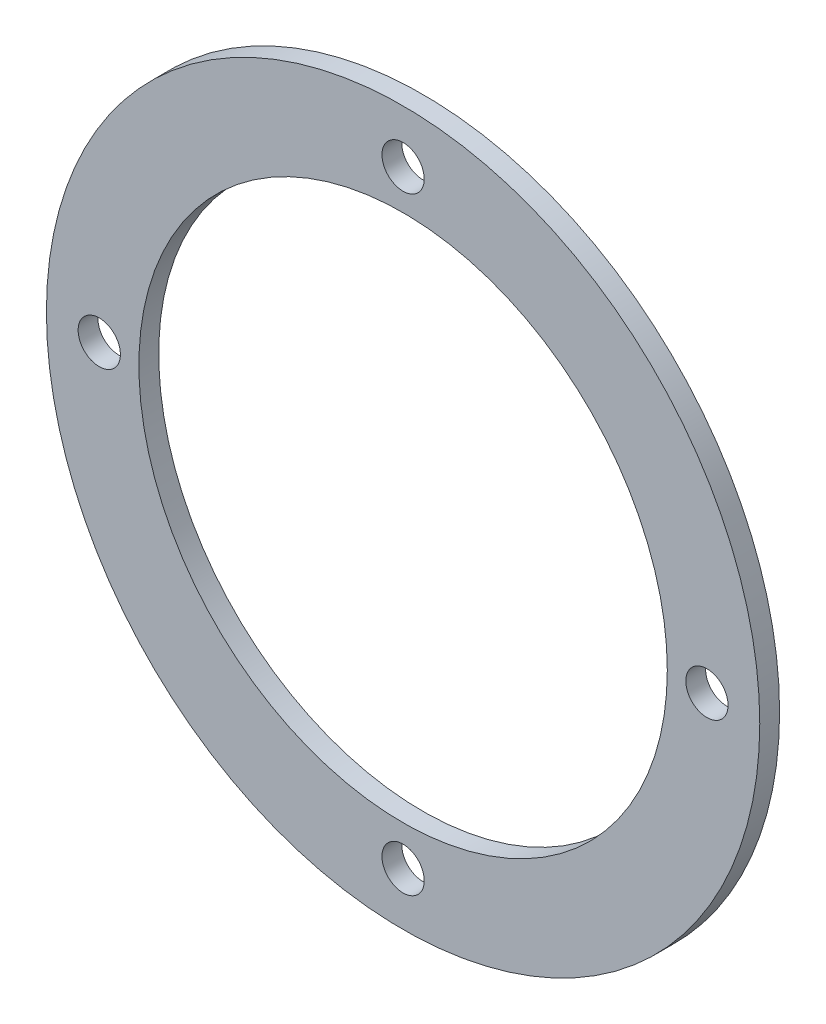
ISO-10303-21;
HEADER;
FILE_DESCRIPTION(('STEP AP214'),'2;1');
FILE_NAME('part.step','',(''),(''),'','','');
FILE_SCHEMA(('AUTOMOTIVE_DESIGN { 1 0 10303 214 1 1 1 1 }'));
ENDSEC;
DATA;
#1=APPLICATION_CONTEXT('core data for automotive mechanical design processes');
#2=APPLICATION_PROTOCOL_DEFINITION('international standard','automotive_design',2000,#1);
#3=PRODUCT_CONTEXT('',#1,'mechanical');
#4=PRODUCT('Part','Part','',(#3));
#5=PRODUCT_RELATED_PRODUCT_CATEGORY('part','',(#4));
#6=PRODUCT_DEFINITION_FORMATION('','',#4);
#7=PRODUCT_DEFINITION_CONTEXT('part definition',#1,'design');
#8=PRODUCT_DEFINITION('design','',#6,#7);
#9=PRODUCT_DEFINITION_SHAPE('','',#8);
#10=(LENGTH_UNIT() NAMED_UNIT(*) SI_UNIT(.MILLI.,.METRE.));
#11=(NAMED_UNIT(*) PLANE_ANGLE_UNIT() SI_UNIT($,.RADIAN.));
#12=(NAMED_UNIT(*) SI_UNIT($,.STERADIAN.) SOLID_ANGLE_UNIT());
#13=UNCERTAINTY_MEASURE_WITH_UNIT(LENGTH_MEASURE(1.E-05),#10,'distance_accuracy_value','');
#14=(GEOMETRIC_REPRESENTATION_CONTEXT(3) GLOBAL_UNCERTAINTY_ASSIGNED_CONTEXT((#13)) GLOBAL_UNIT_ASSIGNED_CONTEXT((#10,
#11,#12)) REPRESENTATION_CONTEXT('',''));
#15=CARTESIAN_POINT('',(0.,0.,0.));
#16=DIRECTION('',(0.,0.,1.));
#17=DIRECTION('',(1.,0.,0.));
#18=AXIS2_PLACEMENT_3D('',#15,#16,#17);
#19=CARTESIAN_POINT('',(0.,0.,1.5));
#20=DIRECTION('',(0.,0.,-1.));
#21=DIRECTION('',(-1.,0.,0.));
#22=AXIS2_PLACEMENT_3D('',#19,#20,#21);
#23=CYLINDRICAL_SURFACE('',#22,20.);
#24=CARTESIAN_POINT('',(0.,0.,1.5));
#25=DIRECTION('',(0.,0.,1.));
#26=DIRECTION('',(1.,0.,0.));
#27=AXIS2_PLACEMENT_3D('',#24,#25,#26);
#28=CIRCLE('',#27,20.);
#29=CARTESIAN_POINT('',(20.,0.,1.5));
#30=VERTEX_POINT('',#29);
#31=EDGE_CURVE('E42',#30,#30,#28,.T.);
#32=ORIENTED_EDGE('',*,*,#31,.T.);
#33=EDGE_LOOP('',(#32));
#34=FACE_BOUND('',#33,.T.);
#35=CARTESIAN_POINT('',(0.,0.,0.));
#36=DIRECTION('',(0.,0.,1.));
#37=DIRECTION('',(1.,0.,0.));
#38=AXIS2_PLACEMENT_3D('',#35,#36,#37);
#39=CIRCLE('',#38,20.);
#40=CARTESIAN_POINT('',(20.,0.,0.));
#41=VERTEX_POINT('',#40);
#42=EDGE_CURVE('E62',#41,#41,#39,.T.);
#43=ORIENTED_EDGE('',*,*,#42,.F.);
#44=EDGE_LOOP('',(#43));
#45=FACE_BOUND('',#44,.T.);
#46=ADVANCED_FACE('F34',(#34,#45),#23,.F.);
#47=CARTESIAN_POINT('',(23.,0.,1.5));
#48=DIRECTION('',(0.,0.,-1.));
#49=DIRECTION('',(-1.,0.,0.));
#50=AXIS2_PLACEMENT_3D('',#47,#48,#49);
#51=CYLINDRICAL_SURFACE('',#50,1.6);
#52=CARTESIAN_POINT('',(23.,0.,1.5));
#53=DIRECTION('',(0.,0.,1.));
#54=DIRECTION('',(1.,0.,0.));
#55=AXIS2_PLACEMENT_3D('',#52,#53,#54);
#56=CIRCLE('',#55,1.6);
#57=CARTESIAN_POINT('',(24.6,0.,1.5));
#58=VERTEX_POINT('',#57);
#59=EDGE_CURVE('E47',#58,#58,#56,.T.);
#60=ORIENTED_EDGE('',*,*,#59,.T.);
#61=EDGE_LOOP('',(#60));
#62=FACE_BOUND('',#61,.T.);
#63=CARTESIAN_POINT('',(23.,0.,0.));
#64=DIRECTION('',(0.,0.,1.));
#65=DIRECTION('',(1.,0.,0.));
#66=AXIS2_PLACEMENT_3D('',#63,#64,#65);
#67=CIRCLE('',#66,1.6);
#68=CARTESIAN_POINT('',(24.6,0.,0.));
#69=VERTEX_POINT('',#68);
#70=EDGE_CURVE('E60',#69,#69,#67,.T.);
#71=ORIENTED_EDGE('',*,*,#70,.F.);
#72=EDGE_LOOP('',(#71));
#73=FACE_BOUND('',#72,.T.);
#74=ADVANCED_FACE('F83',(#62,#73),#51,.F.);
#75=CARTESIAN_POINT('',(0.,-23.,1.5));
#76=DIRECTION('',(0.,0.,-1.));
#77=DIRECTION('',(-1.,0.,0.));
#78=AXIS2_PLACEMENT_3D('',#75,#76,#77);
#79=CYLINDRICAL_SURFACE('',#78,1.6);
#80=CARTESIAN_POINT('',(0.,-23.,1.5));
#81=DIRECTION('',(0.,0.,1.));
#82=DIRECTION('',(1.,0.,0.));
#83=AXIS2_PLACEMENT_3D('',#80,#81,#82);
#84=CIRCLE('',#83,1.6);
#85=CARTESIAN_POINT('',(1.6,-23.,1.5));
#86=VERTEX_POINT('',#85);
#87=EDGE_CURVE('E76',#86,#86,#84,.T.);
#88=ORIENTED_EDGE('',*,*,#87,.T.);
#89=EDGE_LOOP('',(#88));
#90=FACE_BOUND('',#89,.T.);
#91=CARTESIAN_POINT('',(0.,-23.,0.));
#92=DIRECTION('',(0.,0.,1.));
#93=DIRECTION('',(1.,0.,0.));
#94=AXIS2_PLACEMENT_3D('',#91,#92,#93);
#95=CIRCLE('',#94,1.6);
#96=CARTESIAN_POINT('',(1.6,-23.,0.));
#97=VERTEX_POINT('',#96);
#98=EDGE_CURVE('E57',#97,#97,#95,.T.);
#99=ORIENTED_EDGE('',*,*,#98,.F.);
#100=EDGE_LOOP('',(#99));
#101=FACE_BOUND('',#100,.T.);
#102=ADVANCED_FACE('F101',(#90,#101),#79,.F.);
#103=CARTESIAN_POINT('',(-23.,0.,1.5));
#104=DIRECTION('',(0.,0.,-1.));
#105=DIRECTION('',(-1.,0.,0.));
#106=AXIS2_PLACEMENT_3D('',#103,#104,#105);
#107=CYLINDRICAL_SURFACE('',#106,1.6);
#108=CARTESIAN_POINT('',(-23.,0.,1.5));
#109=DIRECTION('',(0.,0.,1.));
#110=DIRECTION('',(1.,0.,0.));
#111=AXIS2_PLACEMENT_3D('',#108,#109,#110);
#112=CIRCLE('',#111,1.6);
#113=CARTESIAN_POINT('',(-21.4,0.,1.5));
#114=VERTEX_POINT('',#113);
#115=EDGE_CURVE('E71',#114,#114,#112,.T.);
#116=ORIENTED_EDGE('',*,*,#115,.T.);
#117=EDGE_LOOP('',(#116));
#118=FACE_BOUND('',#117,.T.);
#119=CARTESIAN_POINT('',(-23.,0.,0.));
#120=DIRECTION('',(0.,0.,1.));
#121=DIRECTION('',(1.,0.,0.));
#122=AXIS2_PLACEMENT_3D('',#119,#120,#121);
#123=CIRCLE('',#122,1.6);
#124=CARTESIAN_POINT('',(-21.4,0.,0.));
#125=VERTEX_POINT('',#124);
#126=EDGE_CURVE('E54',#125,#125,#123,.T.);
#127=ORIENTED_EDGE('',*,*,#126,.F.);
#128=EDGE_LOOP('',(#127));
#129=FACE_BOUND('',#128,.T.);
#130=ADVANCED_FACE('F107',(#118,#129),#107,.F.);
#131=CARTESIAN_POINT('',(0.,23.,1.5));
#132=DIRECTION('',(0.,0.,-1.));
#133=DIRECTION('',(-1.,0.,0.));
#134=AXIS2_PLACEMENT_3D('',#131,#132,#133);
#135=CYLINDRICAL_SURFACE('',#134,1.6);
#136=CARTESIAN_POINT('',(0.,23.,1.5));
#137=DIRECTION('',(0.,0.,1.));
#138=DIRECTION('',(1.,0.,0.));
#139=AXIS2_PLACEMENT_3D('',#136,#137,#138);
#140=CIRCLE('',#139,1.6);
#141=CARTESIAN_POINT('',(1.6,23.,1.5));
#142=VERTEX_POINT('',#141);
#143=EDGE_CURVE('E67',#142,#142,#140,.T.);
#144=ORIENTED_EDGE('',*,*,#143,.T.);
#145=EDGE_LOOP('',(#144));
#146=FACE_BOUND('',#145,.T.);
#147=CARTESIAN_POINT('',(0.,23.,0.));
#148=DIRECTION('',(0.,0.,1.));
#149=DIRECTION('',(1.,0.,0.));
#150=AXIS2_PLACEMENT_3D('',#147,#148,#149);
#151=CIRCLE('',#150,1.6);
#152=CARTESIAN_POINT('',(1.6,23.,0.));
#153=VERTEX_POINT('',#152);
#154=EDGE_CURVE('E51',#153,#153,#151,.T.);
#155=ORIENTED_EDGE('',*,*,#154,.F.);
#156=EDGE_LOOP('',(#155));
#157=FACE_BOUND('',#156,.T.);
#158=ADVANCED_FACE('F36',(#146,#157),#135,.F.);
#159=CARTESIAN_POINT('',(0.,0.,1.5));
#160=DIRECTION('',(0.,0.,-1.));
#161=DIRECTION('',(-1.,0.,0.));
#162=AXIS2_PLACEMENT_3D('',#159,#160,#161);
#163=CYLINDRICAL_SURFACE('',#162,27.);
#164=CARTESIAN_POINT('',(0.,0.,1.5));
#165=DIRECTION('',(0.,0.,1.));
#166=DIRECTION('',(1.,0.,0.));
#167=AXIS2_PLACEMENT_3D('',#164,#165,#166);
#168=CIRCLE('',#167,27.);
#169=CARTESIAN_POINT('',(27.,0.,1.5));
#170=VERTEX_POINT('',#169);
#171=EDGE_CURVE('E10',#170,#170,#168,.T.);
#172=ORIENTED_EDGE('',*,*,#171,.F.);
#173=EDGE_LOOP('',(#172));
#174=FACE_BOUND('',#173,.T.);
#175=CARTESIAN_POINT('',(0.,0.,0.));
#176=DIRECTION('',(0.,0.,1.));
#177=DIRECTION('',(1.,0.,0.));
#178=AXIS2_PLACEMENT_3D('',#175,#176,#177);
#179=CIRCLE('',#178,27.);
#180=CARTESIAN_POINT('',(27.,0.,0.));
#181=VERTEX_POINT('',#180);
#182=EDGE_CURVE('E38',#181,#181,#179,.T.);
#183=ORIENTED_EDGE('',*,*,#182,.T.);
#184=EDGE_LOOP('',(#183));
#185=FACE_BOUND('',#184,.T.);
#186=ADVANCED_FACE('F90',(#174,#185),#163,.T.);
#187=CARTESIAN_POINT('',(0.,0.,1.5));
#188=DIRECTION('',(0.,0.,1.));
#189=DIRECTION('',(1.,0.,0.));
#190=AXIS2_PLACEMENT_3D('',#187,#188,#189);
#191=PLANE('',#190);
#192=ORIENTED_EDGE('',*,*,#143,.F.);
#193=EDGE_LOOP('',(#192));
#194=FACE_BOUND('',#193,.T.);
#195=ORIENTED_EDGE('',*,*,#115,.F.);
#196=EDGE_LOOP('',(#195));
#197=FACE_BOUND('',#196,.T.);
#198=ORIENTED_EDGE('',*,*,#87,.F.);
#199=EDGE_LOOP('',(#198));
#200=FACE_BOUND('',#199,.T.);
#201=ORIENTED_EDGE('',*,*,#59,.F.);
#202=EDGE_LOOP('',(#201));
#203=FACE_BOUND('',#202,.T.);
#204=ORIENTED_EDGE('',*,*,#31,.F.);
#205=EDGE_LOOP('',(#204));
#206=FACE_BOUND('',#205,.T.);
#207=ORIENTED_EDGE('',*,*,#171,.T.);
#208=EDGE_LOOP('',(#207));
#209=FACE_BOUND('',#208,.T.);
#210=ADVANCED_FACE('F86',(#194,#197,#200,#203,#206,#209),#191,.T.);
#211=CARTESIAN_POINT('',(0.,0.,0.));
#212=DIRECTION('',(0.,0.,1.));
#213=DIRECTION('',(1.,0.,0.));
#214=AXIS2_PLACEMENT_3D('',#211,#212,#213);
#215=PLANE('',#214);
#216=ORIENTED_EDGE('',*,*,#154,.T.);
#217=EDGE_LOOP('',(#216));
#218=FACE_BOUND('',#217,.T.);
#219=ORIENTED_EDGE('',*,*,#126,.T.);
#220=EDGE_LOOP('',(#219));
#221=FACE_BOUND('',#220,.T.);
#222=ORIENTED_EDGE('',*,*,#98,.T.);
#223=EDGE_LOOP('',(#222));
#224=FACE_BOUND('',#223,.T.);
#225=ORIENTED_EDGE('',*,*,#70,.T.);
#226=EDGE_LOOP('',(#225));
#227=FACE_BOUND('',#226,.T.);
#228=ORIENTED_EDGE('',*,*,#42,.T.);
#229=EDGE_LOOP('',(#228));
#230=FACE_BOUND('',#229,.T.);
#231=ORIENTED_EDGE('',*,*,#182,.F.);
#232=EDGE_LOOP('',(#231));
#233=FACE_BOUND('',#232,.T.);
#234=ADVANCED_FACE('F89',(#218,#221,#224,#227,#230,#233),#215,.F.);
#235=CLOSED_SHELL('',(#46,#74,#102,#130,#158,#186,#210,#234));
#236=MANIFOLD_SOLID_BREP('B2',#235);
#237=ADVANCED_BREP_SHAPE_REPRESENTATION('',(#18,#236),#14);
#238=SHAPE_DEFINITION_REPRESENTATION(#9,#237);
ENDSEC;
END-ISO-10303-21;
